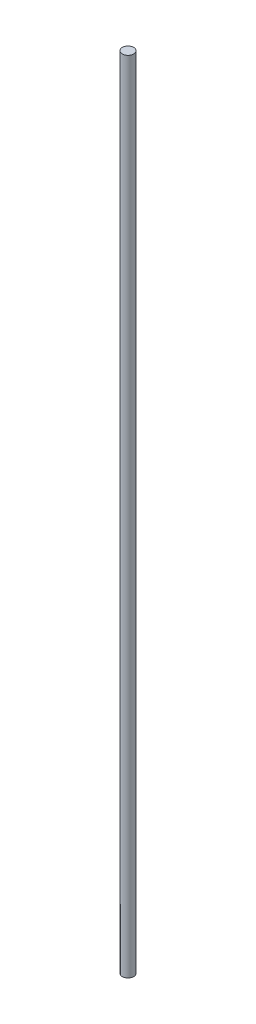
ISO-10303-21;
HEADER;
FILE_DESCRIPTION(('STEP AP214'),'2;1');
FILE_NAME('part.step','',(''),(''),'','','');
FILE_SCHEMA(('AUTOMOTIVE_DESIGN { 1 0 10303 214 1 1 1 1 }'));
ENDSEC;
DATA;
#1=APPLICATION_CONTEXT('core data for automotive mechanical design processes');
#2=APPLICATION_PROTOCOL_DEFINITION('international standard','automotive_design',2000,#1);
#3=PRODUCT_CONTEXT('',#1,'mechanical');
#4=PRODUCT('Part','Part','',(#3));
#5=PRODUCT_RELATED_PRODUCT_CATEGORY('part','',(#4));
#6=PRODUCT_DEFINITION_FORMATION('','',#4);
#7=PRODUCT_DEFINITION_CONTEXT('part definition',#1,'design');
#8=PRODUCT_DEFINITION('design','',#6,#7);
#9=PRODUCT_DEFINITION_SHAPE('','',#8);
#10=(LENGTH_UNIT() NAMED_UNIT(*) SI_UNIT(.MILLI.,.METRE.));
#11=(NAMED_UNIT(*) PLANE_ANGLE_UNIT() SI_UNIT($,.RADIAN.));
#12=(NAMED_UNIT(*) SI_UNIT($,.STERADIAN.) SOLID_ANGLE_UNIT());
#13=UNCERTAINTY_MEASURE_WITH_UNIT(LENGTH_MEASURE(1.E-05),#10,'distance_accuracy_value','');
#14=(GEOMETRIC_REPRESENTATION_CONTEXT(3) GLOBAL_UNCERTAINTY_ASSIGNED_CONTEXT((#13)) GLOBAL_UNIT_ASSIGNED_CONTEXT((#10,
#11,#12)) REPRESENTATION_CONTEXT('',''));
#15=CARTESIAN_POINT('',(0.,0.,0.));
#16=DIRECTION('',(0.,0.,1.));
#17=DIRECTION('',(1.,0.,0.));
#18=AXIS2_PLACEMENT_3D('',#15,#16,#17);
#19=CARTESIAN_POINT('',(0.,140.,0.));
#20=DIRECTION('',(0.,-1.,0.));
#21=DIRECTION('',(0.,0.,-1.));
#22=AXIS2_PLACEMENT_3D('',#19,#20,#21);
#23=CYLINDRICAL_SURFACE('',#22,1.);
#24=CARTESIAN_POINT('',(0.,140.,0.));
#25=DIRECTION('',(0.,1.,0.));
#26=DIRECTION('',(0.,0.,1.));
#27=AXIS2_PLACEMENT_3D('',#24,#25,#26);
#28=CIRCLE('',#27,1.);
#29=CARTESIAN_POINT('',(0.,140.,1.));
#30=VERTEX_POINT('',#29);
#31=EDGE_CURVE('E10',#30,#30,#28,.T.);
#32=ORIENTED_EDGE('',*,*,#31,.F.);
#33=EDGE_LOOP('',(#32));
#34=FACE_BOUND('',#33,.T.);
#35=CARTESIAN_POINT('',(0.,0.,0.));
#36=DIRECTION('',(0.,1.,0.));
#37=DIRECTION('',(0.,0.,1.));
#38=AXIS2_PLACEMENT_3D('',#35,#36,#37);
#39=CIRCLE('',#38,1.);
#40=CARTESIAN_POINT('',(0.,0.,1.));
#41=VERTEX_POINT('',#40);
#42=EDGE_CURVE('E34',#41,#41,#39,.T.);
#43=ORIENTED_EDGE('',*,*,#42,.T.);
#44=EDGE_LOOP('',(#43));
#45=FACE_BOUND('',#44,.T.);
#46=ADVANCED_FACE('F31',(#34,#45),#23,.T.);
#47=CARTESIAN_POINT('',(0.,140.,0.));
#48=DIRECTION('',(0.,1.,0.));
#49=DIRECTION('',(0.,0.,1.));
#50=AXIS2_PLACEMENT_3D('',#47,#48,#49);
#51=PLANE('',#50);
#52=ORIENTED_EDGE('',*,*,#31,.T.);
#53=EDGE_LOOP('',(#52));
#54=FACE_BOUND('',#53,.T.);
#55=ADVANCED_FACE('F46',(#54),#51,.T.);
#56=CARTESIAN_POINT('',(0.,0.,0.));
#57=DIRECTION('',(0.,1.,0.));
#58=DIRECTION('',(0.,0.,1.));
#59=AXIS2_PLACEMENT_3D('',#56,#57,#58);
#60=PLANE('',#59);
#61=ORIENTED_EDGE('',*,*,#42,.F.);
#62=EDGE_LOOP('',(#61));
#63=FACE_BOUND('',#62,.T.);
#64=ADVANCED_FACE('F44',(#63),#60,.F.);
#65=CLOSED_SHELL('',(#46,#55,#64));
#66=MANIFOLD_SOLID_BREP('B2',#65);
#67=ADVANCED_BREP_SHAPE_REPRESENTATION('',(#18,#66),#14);
#68=SHAPE_DEFINITION_REPRESENTATION(#9,#67);
ENDSEC;
END-ISO-10303-21;
